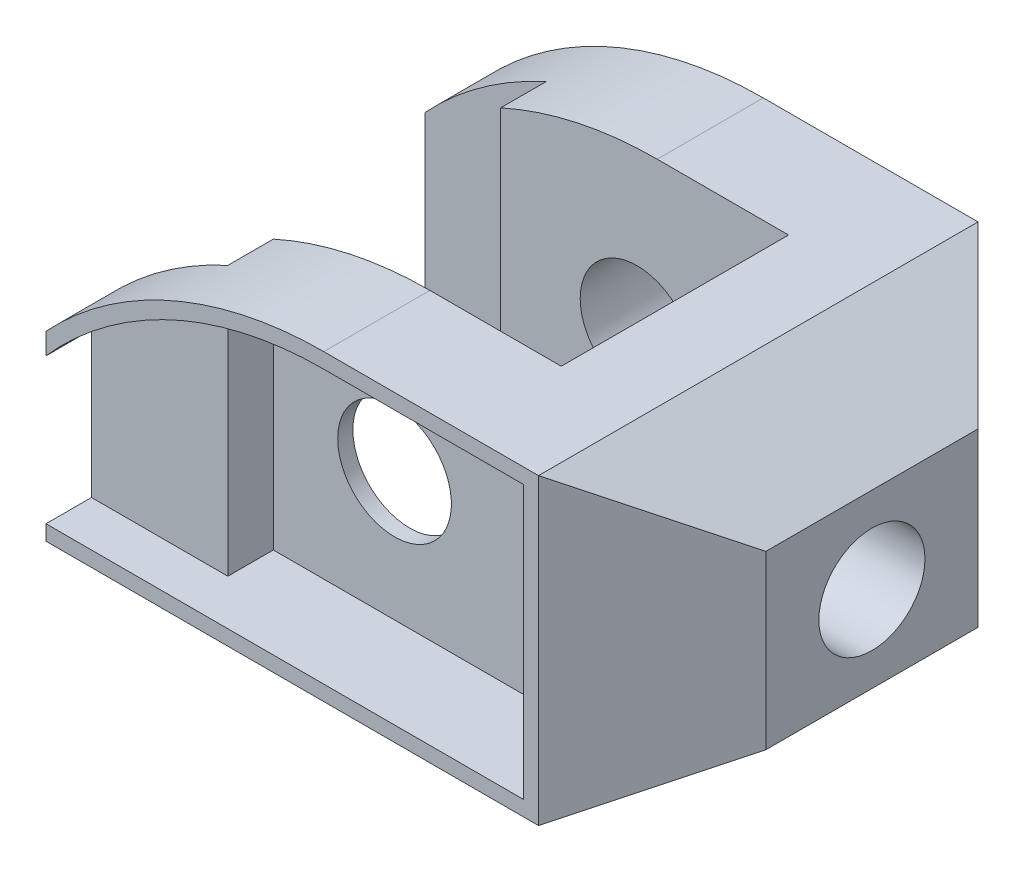
ISO-10303-21;
HEADER;
FILE_DESCRIPTION(('STEP AP214'),'2;1');
FILE_NAME('part.step','',(''),(''),'','','');
FILE_SCHEMA(('AUTOMOTIVE_DESIGN { 1 0 10303 214 1 1 1 1 }'));
ENDSEC;
DATA;
#1=APPLICATION_CONTEXT('core data for automotive mechanical design processes');
#2=APPLICATION_PROTOCOL_DEFINITION('international standard','automotive_design',2000,#1);
#3=PRODUCT_CONTEXT('',#1,'mechanical');
#4=PRODUCT('Part','Part','',(#3));
#5=PRODUCT_RELATED_PRODUCT_CATEGORY('part','',(#4));
#6=PRODUCT_DEFINITION_FORMATION('','',#4);
#7=PRODUCT_DEFINITION_CONTEXT('part definition',#1,'design');
#8=PRODUCT_DEFINITION('design','',#6,#7);
#9=PRODUCT_DEFINITION_SHAPE('','',#8);
#10=(LENGTH_UNIT() NAMED_UNIT(*) SI_UNIT(.MILLI.,.METRE.));
#11=(NAMED_UNIT(*) PLANE_ANGLE_UNIT() SI_UNIT($,.RADIAN.));
#12=(NAMED_UNIT(*) SI_UNIT($,.STERADIAN.) SOLID_ANGLE_UNIT());
#13=UNCERTAINTY_MEASURE_WITH_UNIT(LENGTH_MEASURE(1.E-05),#10,'distance_accuracy_value','');
#14=(GEOMETRIC_REPRESENTATION_CONTEXT(3) GLOBAL_UNCERTAINTY_ASSIGNED_CONTEXT((#13)) GLOBAL_UNIT_ASSIGNED_CONTEXT((#10,
#11,#12)) REPRESENTATION_CONTEXT('',''));
#15=CARTESIAN_POINT('',(0.,0.,0.));
#16=DIRECTION('',(0.,0.,1.));
#17=DIRECTION('',(1.,0.,0.));
#18=AXIS2_PLACEMENT_3D('',#15,#16,#17);
#19=CARTESIAN_POINT('',(-47.,34.2242218715862,46.));
#20=DIRECTION('',(-1.,0.,0.));
#21=DIRECTION('',(0.,-1.,0.));
#22=AXIS2_PLACEMENT_3D('',#19,#20,#21);
#23=PLANE('',#22);
#24=DIRECTION('',(0.,1.,0.));
#25=VECTOR('',#24,1.);
#26=CARTESIAN_POINT('',(-47.,2.,52.));
#27=LINE('',#26,#25);
#28=CARTESIAN_POINT('',(-47.,2.,52.));
#29=VERTEX_POINT('',#28);
#30=CARTESIAN_POINT('',(-47.,34.2242218715862,52.));
#31=VERTEX_POINT('',#30);
#32=EDGE_CURVE('E211',#29,#31,#27,.T.);
#33=ORIENTED_EDGE('',*,*,#32,.F.);
#34=DIRECTION('',(0.,0.,1.));
#35=VECTOR('',#34,1.);
#36=CARTESIAN_POINT('',(-47.,2.,46.));
#37=LINE('',#36,#35);
#38=CARTESIAN_POINT('',(-47.,2.,46.));
#39=VERTEX_POINT('',#38);
#40=EDGE_CURVE('E263',#39,#29,#37,.T.);
#41=ORIENTED_EDGE('',*,*,#40,.F.);
#42=DIRECTION('',(0.,-1.,0.));
#43=VECTOR('',#42,1.);
#44=CARTESIAN_POINT('',(-47.,34.2242218715862,46.));
#45=LINE('',#44,#43);
#46=CARTESIAN_POINT('',(-47.,34.2242218715862,46.));
#47=VERTEX_POINT('',#46);
#48=EDGE_CURVE('E233',#47,#39,#45,.T.);
#49=ORIENTED_EDGE('',*,*,#48,.F.);
#50=DIRECTION('',(0.,0.,1.));
#51=VECTOR('',#50,1.);
#52=CARTESIAN_POINT('',(-47.,34.2242218715862,46.));
#53=LINE('',#52,#51);
#54=EDGE_CURVE('E246',#47,#31,#53,.T.);
#55=ORIENTED_EDGE('',*,*,#54,.T.);
#56=EDGE_LOOP('',(#33,#41,#49,#55));
#57=FACE_BOUND('',#56,.T.);
#58=ADVANCED_FACE('F41',(#57),#23,.F.);
#59=CARTESIAN_POINT('',(-31.,19.,58.));
#60=DIRECTION('',(0.,0.,-1.));
#61=DIRECTION('',(-1.,0.,0.));
#62=AXIS2_PLACEMENT_3D('',#59,#60,#61);
#63=CYLINDRICAL_SURFACE('',#62,7.5);
#64=CARTESIAN_POINT('',(-31.,19.,44.));
#65=DIRECTION('',(0.,0.,1.));
#66=DIRECTION('',(1.,0.,0.));
#67=AXIS2_PLACEMENT_3D('',#64,#65,#66);
#68=CIRCLE('',#67,7.5);
#69=CARTESIAN_POINT('',(-38.5,19.,44.));
#70=VERTEX_POINT('',#69);
#71=EDGE_CURVE('E315',#70,#70,#68,.T.);
#72=CARTESIAN_POINT('',(-31.,19.,46.));
#73=DIRECTION('',(0.,0.,1.));
#74=DIRECTION('',(1.,0.,0.));
#75=AXIS2_PLACEMENT_3D('',#72,#73,#74);
#76=CIRCLE('',#75,7.5);
#77=CARTESIAN_POINT('',(-38.5,19.,46.));
#78=VERTEX_POINT('',#77);
#79=EDGE_CURVE('E45',#78,#78,#76,.T.);
#80=CARTESIAN_POINT('',(-38.5,19.,44.));
#81=CARTESIAN_POINT('',(-38.5,19.,44.0208333333333));
#82=CARTESIAN_POINT('',(-38.5,19.,44.0416666666667));
#83=CARTESIAN_POINT('',(-38.5,19.,44.0833333333333));
#84=CARTESIAN_POINT('',(-38.5,19.,44.1041666666667));
#85=CARTESIAN_POINT('',(-38.5,19.,44.1458333333333));
#86=CARTESIAN_POINT('',(-38.5,19.,44.1666666666667));
#87=CARTESIAN_POINT('',(-38.5,19.,44.2083333333333));
#88=CARTESIAN_POINT('',(-38.5,19.,44.2291666666667));
#89=CARTESIAN_POINT('',(-38.5,19.,44.2708333333333));
#90=CARTESIAN_POINT('',(-38.5,19.,44.2916666666667));
#91=CARTESIAN_POINT('',(-38.5,19.,44.3333333333333));
#92=CARTESIAN_POINT('',(-38.5,19.,44.3541666666667));
#93=CARTESIAN_POINT('',(-38.5,19.,44.3958333333333));
#94=CARTESIAN_POINT('',(-38.5,19.,44.4166666666667));
#95=CARTESIAN_POINT('',(-38.5,19.,44.4583333333333));
#96=CARTESIAN_POINT('',(-38.5,19.,44.4791666666667));
#97=CARTESIAN_POINT('',(-38.5,19.,44.5208333333333));
#98=CARTESIAN_POINT('',(-38.5,19.,44.5416666666667));
#99=CARTESIAN_POINT('',(-38.5,19.,44.5833333333333));
#100=CARTESIAN_POINT('',(-38.5,19.,44.6041666666667));
#101=CARTESIAN_POINT('',(-38.5,19.,44.6458333333333));
#102=CARTESIAN_POINT('',(-38.5,19.,44.6666666666667));
#103=CARTESIAN_POINT('',(-38.5,19.,44.7083333333333));
#104=CARTESIAN_POINT('',(-38.5,19.,44.7291666666667));
#105=CARTESIAN_POINT('',(-38.5,19.,44.7708333333333));
#106=CARTESIAN_POINT('',(-38.5,19.,44.7916666666667));
#107=CARTESIAN_POINT('',(-38.5,19.,44.8333333333333));
#108=CARTESIAN_POINT('',(-38.5,19.,44.8541666666667));
#109=CARTESIAN_POINT('',(-38.5,19.,44.8958333333333));
#110=CARTESIAN_POINT('',(-38.5,19.,44.9166666666667));
#111=CARTESIAN_POINT('',(-38.5,19.,44.9583333333333));
#112=CARTESIAN_POINT('',(-38.5,19.,44.9791666666667));
#113=CARTESIAN_POINT('',(-38.5,19.,45.0208333333333));
#114=CARTESIAN_POINT('',(-38.5,19.,45.0416666666667));
#115=CARTESIAN_POINT('',(-38.5,19.,45.0833333333333));
#116=CARTESIAN_POINT('',(-38.5,19.,45.1041666666667));
#117=CARTESIAN_POINT('',(-38.5,19.,45.1458333333333));
#118=CARTESIAN_POINT('',(-38.5,19.,45.1666666666667));
#119=CARTESIAN_POINT('',(-38.5,19.,45.2083333333333));
#120=CARTESIAN_POINT('',(-38.5,19.,45.2291666666667));
#121=CARTESIAN_POINT('',(-38.5,19.,45.2708333333333));
#122=CARTESIAN_POINT('',(-38.5,19.,45.2916666666667));
#123=CARTESIAN_POINT('',(-38.5,19.,45.3333333333333));
#124=CARTESIAN_POINT('',(-38.5,19.,45.3541666666667));
#125=CARTESIAN_POINT('',(-38.5,19.,45.3958333333333));
#126=CARTESIAN_POINT('',(-38.5,19.,45.4166666666667));
#127=CARTESIAN_POINT('',(-38.5,19.,45.4583333333333));
#128=CARTESIAN_POINT('',(-38.5,19.,45.4791666666667));
#129=CARTESIAN_POINT('',(-38.5,19.,45.5208333333333));
#130=CARTESIAN_POINT('',(-38.5,19.,45.5416666666667));
#131=CARTESIAN_POINT('',(-38.5,19.,45.5833333333333));
#132=CARTESIAN_POINT('',(-38.5,19.,45.6041666666667));
#133=CARTESIAN_POINT('',(-38.5,19.,45.6458333333333));
#134=CARTESIAN_POINT('',(-38.5,19.,45.6666666666667));
#135=CARTESIAN_POINT('',(-38.5,19.,45.7083333333333));
#136=CARTESIAN_POINT('',(-38.5,19.,45.7291666666667));
#137=CARTESIAN_POINT('',(-38.5,19.,45.7708333333333));
#138=CARTESIAN_POINT('',(-38.5,19.,45.7916666666667));
#139=CARTESIAN_POINT('',(-38.5,19.,45.8333333333333));
#140=CARTESIAN_POINT('',(-38.5,19.,45.8541666666667));
#141=CARTESIAN_POINT('',(-38.5,19.,45.8958333333333));
#142=CARTESIAN_POINT('',(-38.5,19.,45.9166666666667));
#143=CARTESIAN_POINT('',(-38.5,19.,45.9583333333333));
#144=CARTESIAN_POINT('',(-38.5,19.,45.9791666666667));
#145=CARTESIAN_POINT('',(-38.5,19.,46.));
#146=B_SPLINE_CURVE_WITH_KNOTS('',3,(#80,#81,#82,#83,#84,#85,#86,#87,#88,#89,#90,#91,#92,#93,
#94,#95,#96,#97,#98,#99,#100,#101,#102,#103,#104,#105,#106,#107,#108,#109,#110,#111,#112,#113,
#114,#115,#116,#117,#118,#119,#120,#121,#122,#123,#124,#125,#126,#127,#128,#129,#130,#131,#132,
#133,#134,#135,#136,#137,#138,#139,#140,#141,#142,#143,#144,#145),.UNSPECIFIED.,.F.,.F.,(4,2,2,
2,2,2,2,2,2,2,2,2,2,2,2,2,2,2,2,2,2,2,2,2,2,2,2,2,2,2,2,2,4),(0.,0.0625000000000001,0.125,
0.1875,0.25,0.3125,0.374999999999993,0.437499999999993,0.499999999999994,0.562499999999994,
0.624999999999994,0.687499999999994,0.749999999999994,0.812499999999994,0.874999999999994,
0.937499999999987,0.999999999999987,1.06249999999999,1.12499999999999,1.18749999999999,
1.24999999999999,1.31249999999999,1.37499999999998,1.43749999999998,1.49999999999998,
1.56249999999998,1.62499999999998,1.68749999999998,1.74999999999998,1.81249999999998,
1.87499999999998,1.93749999999997,1.99999999999997),.UNSPECIFIED.);
#147=EDGE_CURVE('BSEAM413',#70,#78,#146,.T.);
#148=ORIENTED_EDGE('',*,*,#71,.F.);
#149=ORIENTED_EDGE('',*,*,#79,.T.);
#150=ORIENTED_EDGE('',*,*,#147,.T.);
#151=ORIENTED_EDGE('',*,*,#147,.F.);
#152=EDGE_LOOP('',(#148,#150,#149,#151));
#153=FACE_BOUND('',#152,.T.);
#154=ADVANCED_FACE('F413',(#153),#63,.F.);
#155=CARTESIAN_POINT('',(-28.3393944403533,-10.,58.));
#156=DIRECTION('',(0.,0.,-1.));
#157=DIRECTION('',(-1.,0.,0.));
#158=AXIS2_PLACEMENT_3D('',#155,#156,#157);
#159=PLANE('',#158);
#160=DIRECTION('',(0.,-1.,0.));
#161=VECTOR('',#160,1.);
#162=CARTESIAN_POINT('',(-65.,0.,58.));
#163=LINE('',#162,#161);
#164=CARTESIAN_POINT('',(-65.,24.,58.));
#165=VERTEX_POINT('',#164);
#166=CARTESIAN_POINT('',(-65.,21.1865019003667,58.));
#167=VERTEX_POINT('',#166);
#168=EDGE_CURVE('E364',#165,#167,#163,.T.);
#169=ORIENTED_EDGE('',*,*,#168,.T.);
#170=CARTESIAN_POINT('',(-27.4075472422431,-11.7696499087035,58.));
#171=DIRECTION('',(0.,0.,1.));
#172=DIRECTION('',(1.,0.,0.));
#173=AXIS2_PLACEMENT_3D('',#170,#171,#172);
#174=CIRCLE('',#173,49.9930039746229);
#175=CARTESIAN_POINT('',(-47.,34.2242218715862,58.));
#176=VERTEX_POINT('',#175);
#177=EDGE_CURVE('E205',#176,#167,#174,.T.);
#178=ORIENTED_EDGE('',*,*,#177,.F.);
#179=CARTESIAN_POINT('',(-28.3393944403533,-10.,58.));
#180=DIRECTION('',(0.,0.,1.));
#181=DIRECTION('',(1.,0.,0.));
#182=AXIS2_PLACEMENT_3D('',#179,#180,#181);
#183=CIRCLE('',#182,48.);
#184=CARTESIAN_POINT('',(-28.3393944403533,38.,58.));
#185=VERTEX_POINT('',#184);
#186=EDGE_CURVE('E228',#185,#176,#183,.T.);
#187=ORIENTED_EDGE('',*,*,#186,.F.);
#188=DIRECTION('',(-1.,0.,0.));
#189=VECTOR('',#188,1.);
#190=CARTESIAN_POINT('',(-2.,38.,58.));
#191=LINE('',#190,#189);
#192=CARTESIAN_POINT('',(-2.,38.,58.));
#193=VERTEX_POINT('',#192);
#194=EDGE_CURVE('E234',#193,#185,#191,.T.);
#195=ORIENTED_EDGE('',*,*,#194,.F.);
#196=DIRECTION('',(0.,1.,0.));
#197=VECTOR('',#196,1.);
#198=CARTESIAN_POINT('',(-2.,2.,58.));
#199=LINE('',#198,#197);
#200=CARTESIAN_POINT('',(-2.,2.,58.));
#201=VERTEX_POINT('',#200);
#202=EDGE_CURVE('E252',#201,#193,#199,.T.);
#203=ORIENTED_EDGE('',*,*,#202,.F.);
#204=DIRECTION('',(1.,0.,0.));
#205=VECTOR('',#204,1.);
#206=CARTESIAN_POINT('',(-47.,2.,58.));
#207=LINE('',#206,#205);
#208=CARTESIAN_POINT('',(-65.,1.99999999999999,58.));
#209=VERTEX_POINT('',#208);
#210=EDGE_CURVE('E249',#209,#201,#207,.T.);
#211=ORIENTED_EDGE('',*,*,#210,.F.);
#212=CARTESIAN_POINT('',(-65.,0.,58.));
#213=VERTEX_POINT('',#212);
#214=EDGE_CURVE('E363',#209,#213,#163,.T.);
#215=ORIENTED_EDGE('',*,*,#214,.T.);
#216=DIRECTION('',(1.,0.,0.));
#217=VECTOR('',#216,1.);
#218=CARTESIAN_POINT('',(0.,0.,58.));
#219=LINE('',#218,#217);
#220=CARTESIAN_POINT('',(0.,0.,58.));
#221=VERTEX_POINT('',#220);
#222=EDGE_CURVE('E366',#213,#221,#219,.T.);
#223=ORIENTED_EDGE('',*,*,#222,.T.);
#224=DIRECTION('',(0.,-1.,0.));
#225=VECTOR('',#224,1.);
#226=CARTESIAN_POINT('',(0.,40.,58.));
#227=LINE('',#226,#225);
#228=CARTESIAN_POINT('',(0.,40.,58.));
#229=VERTEX_POINT('',#228);
#230=EDGE_CURVE('E275',#229,#221,#227,.T.);
#231=ORIENTED_EDGE('',*,*,#230,.F.);
#232=DIRECTION('',(-1.,0.,0.));
#233=VECTOR('',#232,1.);
#234=CARTESIAN_POINT('',(0.,40.,58.));
#235=LINE('',#234,#233);
#236=CARTESIAN_POINT('',(-28.3393944403533,40.,58.));
#237=VERTEX_POINT('',#236);
#238=EDGE_CURVE('E358',#229,#237,#235,.T.);
#239=ORIENTED_EDGE('',*,*,#238,.T.);
#240=CARTESIAN_POINT('',(-28.3393944403533,-10.,58.));
#241=DIRECTION('',(0.,0.,1.));
#242=DIRECTION('',(-1.,0.,0.));
#243=AXIS2_PLACEMENT_3D('',#240,#241,#242);
#244=CIRCLE('',#243,50.);
#245=EDGE_CURVE('E360',#237,#165,#244,.T.);
#246=ORIENTED_EDGE('',*,*,#245,.T.);
#247=EDGE_LOOP('',(#169,#178,#187,#195,#203,#211,#215,#223,#231,#239,#246));
#248=FACE_BOUND('',#247,.T.);
#249=ADVANCED_FACE('F436',(#248),#159,.F.);
#250=CARTESIAN_POINT('',(-28.3393944403533,-10.,0.));
#251=DIRECTION('',(0.,0.,-1.));
#252=DIRECTION('',(-1.,0.,0.));
#253=AXIS2_PLACEMENT_3D('',#250,#251,#252);
#254=PLANE('',#253);
#255=CARTESIAN_POINT('',(-31.,19.,0.));
#256=DIRECTION('',(0.,0.,1.));
#257=DIRECTION('',(1.,0.,0.));
#258=AXIS2_PLACEMENT_3D('',#255,#256,#257);
#259=CIRCLE('',#258,7.5);
#260=CARTESIAN_POINT('',(-38.5,19.,0.));
#261=VERTEX_POINT('',#260);
#262=EDGE_CURVE('E354',#261,#261,#259,.T.);
#263=ORIENTED_EDGE('',*,*,#262,.T.);
#264=EDGE_LOOP('',(#263));
#265=FACE_BOUND('',#264,.T.);
#266=DIRECTION('',(-1.,0.,0.));
#267=VECTOR('',#266,1.);
#268=CARTESIAN_POINT('',(0.,40.,0.));
#269=LINE('',#268,#267);
#270=CARTESIAN_POINT('',(0.,40.,0.));
#271=VERTEX_POINT('',#270);
#272=CARTESIAN_POINT('',(-28.3393944403533,40.,0.));
#273=VERTEX_POINT('',#272);
#274=EDGE_CURVE('E357',#271,#273,#269,.T.);
#275=ORIENTED_EDGE('',*,*,#274,.F.);
#276=DIRECTION('',(0.,-1.,0.));
#277=VECTOR('',#276,1.);
#278=CARTESIAN_POINT('',(0.,40.,0.));
#279=LINE('',#278,#277);
#280=CARTESIAN_POINT('',(0.,0.,0.));
#281=VERTEX_POINT('',#280);
#282=EDGE_CURVE('E274',#271,#281,#279,.T.);
#283=ORIENTED_EDGE('',*,*,#282,.T.);
#284=DIRECTION('',(1.,0.,0.));
#285=VECTOR('',#284,1.);
#286=CARTESIAN_POINT('',(0.,0.,0.));
#287=LINE('',#286,#285);
#288=CARTESIAN_POINT('',(-65.,0.,0.));
#289=VERTEX_POINT('',#288);
#290=EDGE_CURVE('E361',#289,#281,#287,.T.);
#291=ORIENTED_EDGE('',*,*,#290,.F.);
#292=DIRECTION('',(0.,-1.,0.));
#293=VECTOR('',#292,1.);
#294=CARTESIAN_POINT('',(-65.,0.,0.));
#295=LINE('',#294,#293);
#296=CARTESIAN_POINT('',(-65.,24.,0.));
#297=VERTEX_POINT('',#296);
#298=EDGE_CURVE('E375',#297,#289,#295,.T.);
#299=ORIENTED_EDGE('',*,*,#298,.F.);
#300=CARTESIAN_POINT('',(-28.3393944403533,-10.,0.));
#301=DIRECTION('',(0.,0.,1.));
#302=DIRECTION('',(-1.,0.,0.));
#303=AXIS2_PLACEMENT_3D('',#300,#301,#302);
#304=CIRCLE('',#303,50.);
#305=EDGE_CURVE('E372',#273,#297,#304,.T.);
#306=ORIENTED_EDGE('',*,*,#305,.F.);
#307=EDGE_LOOP('',(#275,#283,#291,#299,#306));
#308=FACE_BOUND('',#307,.T.);
#309=ADVANCED_FACE('F510',(#265,#308),#254,.T.);
#310=CARTESIAN_POINT('',(0.,0.,58.));
#311=DIRECTION('',(-0.499999999999995,0.866025403784441,0.));
#312=DIRECTION('',(-0.866025403784442,-0.499999999999995,0.));
#313=AXIS2_PLACEMENT_3D('',#310,#311,#312);
#314=PLANE('',#313);
#315=DIRECTION('',(-0.654653670707977,-0.377964473009222,-0.65465367070798));
#316=VECTOR('',#315,1.);
#317=CARTESIAN_POINT('',(24.857142857143,14.3512781198563,24.857142857143));
#318=LINE('',#317,#316);
#319=CARTESIAN_POINT('',(15.,8.66025403784428,15.));
#320=VERTEX_POINT('',#319);
#321=EDGE_CURVE('E282',#320,#281,#318,.T.);
#322=ORIENTED_EDGE('',*,*,#321,.F.);
#323=DIRECTION('',(0.,0.,-1.));
#324=VECTOR('',#323,1.);
#325=CARTESIAN_POINT('',(15.,8.66025403784427,58.));
#326=LINE('',#325,#324);
#327=CARTESIAN_POINT('',(15.,8.66025403784428,43.));
#328=VERTEX_POINT('',#327);
#329=EDGE_CURVE('E400',#328,#320,#326,.T.);
#330=ORIENTED_EDGE('',*,*,#329,.F.);
#331=DIRECTION('',(0.654653670707977,0.377964473009222,-0.65465367070798));
#332=VECTOR('',#331,1.);
#333=CARTESIAN_POINT('',(0.,0.,58.));
#334=LINE('',#333,#332);
#335=EDGE_CURVE('E278',#221,#328,#334,.T.);
#336=ORIENTED_EDGE('',*,*,#335,.F.);
#337=DIRECTION('',(0.,0.,-1.));
#338=VECTOR('',#337,1.);
#339=CARTESIAN_POINT('',(0.,0.,58.));
#340=LINE('',#339,#338);
#341=EDGE_CURVE('E369',#221,#281,#340,.T.);
#342=ORIENTED_EDGE('',*,*,#341,.T.);
#343=EDGE_LOOP('',(#322,#330,#336,#342));
#344=FACE_BOUND('',#343,.T.);
#345=ADVANCED_FACE('F43',(#344),#314,.F.);
#346=CARTESIAN_POINT('',(15.,8.66025403784427,58.));
#347=DIRECTION('',(-1.,0.,0.));
#348=DIRECTION('',(0.,-1.,0.));
#349=AXIS2_PLACEMENT_3D('',#346,#347,#348);
#350=PLANE('',#349);
#351=CARTESIAN_POINT('',(15.,20.,29.));
#352=DIRECTION('',(-1.,0.,0.));
#353=DIRECTION('',(0.,-1.,0.));
#354=AXIS2_PLACEMENT_3D('',#351,#352,#353);
#355=CIRCLE('',#354,7.);
#356=CARTESIAN_POINT('',(15.,13.,29.));
#357=VERTEX_POINT('',#356);
#358=EDGE_CURVE('E268',#357,#357,#355,.T.);
#359=ORIENTED_EDGE('',*,*,#358,.T.);
#360=EDGE_LOOP('',(#359));
#361=FACE_BOUND('',#360,.T.);
#362=DIRECTION('',(0.,-1.,0.));
#363=VECTOR('',#362,1.);
#364=CARTESIAN_POINT('',(15.,40.,15.));
#365=LINE('',#364,#363);
#366=CARTESIAN_POINT('',(15.,31.3397459621556,15.));
#367=VERTEX_POINT('',#366);
#368=EDGE_CURVE('E272',#367,#320,#365,.T.);
#369=ORIENTED_EDGE('',*,*,#368,.F.);
#370=DIRECTION('',(0.,0.,-1.));
#371=VECTOR('',#370,1.);
#372=CARTESIAN_POINT('',(15.,31.3397459621556,58.));
#373=LINE('',#372,#371);
#374=CARTESIAN_POINT('',(15.,31.3397459621556,43.));
#375=VERTEX_POINT('',#374);
#376=EDGE_CURVE('E397',#375,#367,#373,.T.);
#377=ORIENTED_EDGE('',*,*,#376,.F.);
#378=DIRECTION('',(0.,-1.,0.));
#379=VECTOR('',#378,1.);
#380=CARTESIAN_POINT('',(15.,40.,43.));
#381=LINE('',#380,#379);
#382=EDGE_CURVE('E66',#375,#328,#381,.T.);
#383=ORIENTED_EDGE('',*,*,#382,.T.);
#384=ORIENTED_EDGE('',*,*,#329,.T.);
#385=EDGE_LOOP('',(#369,#377,#383,#384));
#386=FACE_BOUND('',#385,.T.);
#387=ADVANCED_FACE('F530',(#361,#386),#350,.F.);
#388=CARTESIAN_POINT('',(15.,31.3397459621556,58.));
#389=DIRECTION('',(-0.500000000000001,-0.866025403784438,0.));
#390=DIRECTION('',(0.866025403784438,-0.500000000000001,0.));
#391=AXIS2_PLACEMENT_3D('',#388,#389,#390);
#392=PLANE('',#391);
#393=DIRECTION('',(0.654653670707976,-0.377964473009227,0.654653670707978));
#394=VECTOR('',#393,1.);
#395=CARTESIAN_POINT('',(33.4285714285714,20.7000052870896,33.4285714285715));
#396=LINE('',#395,#394);
#397=EDGE_CURVE('E11',#271,#367,#396,.T.);
#398=ORIENTED_EDGE('',*,*,#397,.F.);
#399=DIRECTION('',(0.,0.,-1.));
#400=VECTOR('',#399,1.);
#401=CARTESIAN_POINT('',(0.,40.,58.));
#402=LINE('',#401,#400);
#403=EDGE_CURVE('E394',#229,#271,#402,.T.);
#404=ORIENTED_EDGE('',*,*,#403,.F.);
#405=DIRECTION('',(-0.654653670707976,0.377964473009227,0.654653670707978));
#406=VECTOR('',#405,1.);
#407=CARTESIAN_POINT('',(8.57142857142856,35.0512834069461,49.4285714285714));
#408=LINE('',#407,#406);
#409=EDGE_CURVE('E50',#375,#229,#408,.T.);
#410=ORIENTED_EDGE('',*,*,#409,.F.);
#411=ORIENTED_EDGE('',*,*,#376,.T.);
#412=EDGE_LOOP('',(#398,#404,#410,#411));
#413=FACE_BOUND('',#412,.T.);
#414=ADVANCED_FACE('F528',(#413),#392,.F.);
#415=CARTESIAN_POINT('',(-28.3393944403533,-10.,58.));
#416=DIRECTION('',(0.,0.,-1.));
#417=DIRECTION('',(-1.,0.,0.));
#418=AXIS2_PLACEMENT_3D('',#415,#416,#417);
#419=CYLINDRICAL_SURFACE('',#418,50.);
#420=DIRECTION('',(0.,0.,-1.));
#421=VECTOR('',#420,1.);
#422=CARTESIAN_POINT('',(-28.3393944403533,40.,58.));
#423=LINE('',#422,#421);
#424=CARTESIAN_POINT('',(-28.3393944403533,40.,44.));
#425=VERTEX_POINT('',#424);
#426=EDGE_CURVE('E391',#237,#425,#423,.T.);
#427=ORIENTED_EDGE('',*,*,#426,.T.);
#428=CARTESIAN_POINT('',(-28.3393944403533,-10.,44.));
#429=DIRECTION('',(0.,0.,1.));
#430=DIRECTION('',(1.,0.,0.));
#431=AXIS2_PLACEMENT_3D('',#428,#429,#430);
#432=CIRCLE('',#431,50.);
#433=CARTESIAN_POINT('',(-49.,35.5317403347236,44.));
#434=VERTEX_POINT('',#433);
#435=EDGE_CURVE('E335',#425,#434,#432,.T.);
#436=ORIENTED_EDGE('',*,*,#435,.T.);
#437=DIRECTION('',(0.,0.,-1.));
#438=VECTOR('',#437,1.);
#439=CARTESIAN_POINT('',(-49.,35.5317403347236,58.));
#440=LINE('',#439,#438);
#441=CARTESIAN_POINT('',(-49.,35.5317403347236,50.));
#442=VERTEX_POINT('',#441);
#443=EDGE_CURVE('E351',#434,#442,#440,.F.);
#444=ORIENTED_EDGE('',*,*,#443,.T.);
#445=CARTESIAN_POINT('',(-28.3393944403533,-10.,50.));
#446=DIRECTION('',(0.,0.,1.));
#447=DIRECTION('',(1.,0.,0.));
#448=AXIS2_PLACEMENT_3D('',#445,#446,#447);
#449=CIRCLE('',#448,50.);
#450=CARTESIAN_POINT('',(-65.,24.,50.));
#451=VERTEX_POINT('',#450);
#452=EDGE_CURVE('E348',#442,#451,#449,.T.);
#453=ORIENTED_EDGE('',*,*,#452,.T.);
#454=DIRECTION('',(0.,0.,-1.));
#455=VECTOR('',#454,1.);
#456=CARTESIAN_POINT('',(-65.,24.,58.));
#457=LINE('',#456,#455);
#458=EDGE_CURVE('E387',#165,#451,#457,.T.);
#459=ORIENTED_EDGE('',*,*,#458,.F.);
#460=ORIENTED_EDGE('',*,*,#245,.F.);
#461=EDGE_LOOP('',(#427,#436,#444,#453,#459,#460));
#462=FACE_BOUND('',#461,.T.);
#463=ADVANCED_FACE('F442',(#462),#419,.T.);
#464=CARTESIAN_POINT('',(-65.,0.,58.));
#465=DIRECTION('',(1.,0.,0.));
#466=DIRECTION('',(0.,0.,-1.));
#467=AXIS2_PLACEMENT_3D('',#464,#465,#466);
#468=PLANE('',#467);
#469=DIRECTION('',(0.,-1.,0.));
#470=VECTOR('',#469,1.);
#471=CARTESIAN_POINT('',(-65.,21.1865019003667,52.));
#472=LINE('',#471,#470);
#473=CARTESIAN_POINT('',(-65.,21.1865019003667,52.));
#474=VERTEX_POINT('',#473);
#475=CARTESIAN_POINT('',(-65.,1.99999999999999,52.));
#476=VERTEX_POINT('',#475);
#477=EDGE_CURVE('E214',#474,#476,#472,.T.);
#478=ORIENTED_EDGE('',*,*,#477,.F.);
#479=DIRECTION('',(0.,0.,1.));
#480=VECTOR('',#479,1.);
#481=CARTESIAN_POINT('',(-65.,21.1865019003667,52.));
#482=LINE('',#481,#480);
#483=EDGE_CURVE('E200',#474,#167,#482,.T.);
#484=ORIENTED_EDGE('',*,*,#483,.T.);
#485=ORIENTED_EDGE('',*,*,#168,.F.);
#486=ORIENTED_EDGE('',*,*,#458,.T.);
#487=DIRECTION('',(0.,1.,0.));
#488=VECTOR('',#487,1.);
#489=CARTESIAN_POINT('',(-65.,0.,50.));
#490=LINE('',#489,#488);
#491=CARTESIAN_POINT('',(-65.,0.,50.));
#492=VERTEX_POINT('',#491);
#493=EDGE_CURVE('E325',#492,#451,#490,.T.);
#494=ORIENTED_EDGE('',*,*,#493,.F.);
#495=DIRECTION('',(0.,0.,-1.));
#496=VECTOR('',#495,1.);
#497=CARTESIAN_POINT('',(-65.,0.,58.));
#498=LINE('',#497,#496);
#499=EDGE_CURVE('E383',#213,#492,#498,.T.);
#500=ORIENTED_EDGE('',*,*,#499,.F.);
#501=ORIENTED_EDGE('',*,*,#214,.F.);
#502=DIRECTION('',(0.,0.,1.));
#503=VECTOR('',#502,1.);
#504=CARTESIAN_POINT('',(-65.,1.99999999999999,52.));
#505=LINE('',#504,#503);
#506=EDGE_CURVE('E210',#476,#209,#505,.T.);
#507=ORIENTED_EDGE('',*,*,#506,.F.);
#508=EDGE_LOOP('',(#478,#484,#485,#486,#494,#500,#501,#507));
#509=FACE_BOUND('',#508,.T.);
#510=ADVANCED_FACE('F218',(#509),#468,.F.);
#511=CARTESIAN_POINT('',(-31.,19.,14.));
#512=DIRECTION('',(0.,0.,-1.));
#513=DIRECTION('',(-1.,0.,0.));
#514=AXIS2_PLACEMENT_3D('',#511,#512,#513);
#515=CIRCLE('',#514,7.5);
#516=CARTESIAN_POINT('',(-38.5,19.,14.));
#517=VERTEX_POINT('',#516);
#518=EDGE_CURVE('E338',#517,#517,#515,.T.);
#519=CARTESIAN_POINT('',(-38.5,19.,14.));
#520=CARTESIAN_POINT('',(-38.5,19.,13.8541666666667));
#521=CARTESIAN_POINT('',(-38.5,19.,13.7083333333333));
#522=CARTESIAN_POINT('',(-38.5,19.,13.4166666666667));
#523=CARTESIAN_POINT('',(-38.5,19.,13.2708333333333));
#524=CARTESIAN_POINT('',(-38.5,19.,12.9791666666667));
#525=CARTESIAN_POINT('',(-38.5,19.,12.8333333333333));
#526=CARTESIAN_POINT('',(-38.5,19.,12.5416666666667));
#527=CARTESIAN_POINT('',(-38.5,19.,12.3958333333333));
#528=CARTESIAN_POINT('',(-38.5,19.,12.1041666666667));
#529=CARTESIAN_POINT('',(-38.5,19.,11.9583333333333));
#530=CARTESIAN_POINT('',(-38.5,19.,11.6666666666667));
#531=CARTESIAN_POINT('',(-38.5,19.,11.5208333333333));
#532=CARTESIAN_POINT('',(-38.5,19.,11.2291666666667));
#533=CARTESIAN_POINT('',(-38.5,19.,11.0833333333333));
#534=CARTESIAN_POINT('',(-38.5,19.,10.7916666666667));
#535=CARTESIAN_POINT('',(-38.5,19.,10.6458333333333));
#536=CARTESIAN_POINT('',(-38.5,19.,10.3541666666667));
#537=CARTESIAN_POINT('',(-38.5,19.,10.2083333333333));
#538=CARTESIAN_POINT('',(-38.5,19.,9.91666666666667));
#539=CARTESIAN_POINT('',(-38.5,19.,9.77083333333333));
#540=CARTESIAN_POINT('',(-38.5,19.,9.47916666666667));
#541=CARTESIAN_POINT('',(-38.5,19.,9.33333333333333));
#542=CARTESIAN_POINT('',(-38.5,19.,9.04166666666667));
#543=CARTESIAN_POINT('',(-38.5,19.,8.89583333333333));
#544=CARTESIAN_POINT('',(-38.5,19.,8.60416666666667));
#545=CARTESIAN_POINT('',(-38.5,19.,8.45833333333333));
#546=CARTESIAN_POINT('',(-38.5,19.,8.16666666666667));
#547=CARTESIAN_POINT('',(-38.5,19.,8.02083333333333));
#548=CARTESIAN_POINT('',(-38.5,19.,7.72916666666667));
#549=CARTESIAN_POINT('',(-38.5,19.,7.58333333333333));
#550=CARTESIAN_POINT('',(-38.5,19.,7.29166666666667));
#551=CARTESIAN_POINT('',(-38.5,19.,7.14583333333333));
#552=CARTESIAN_POINT('',(-38.5,19.,6.85416666666667));
#553=CARTESIAN_POINT('',(-38.5,19.,6.70833333333333));
#554=CARTESIAN_POINT('',(-38.5,19.,6.41666666666667));
#555=CARTESIAN_POINT('',(-38.5,19.,6.27083333333333));
#556=CARTESIAN_POINT('',(-38.5,19.,5.97916666666667));
#557=CARTESIAN_POINT('',(-38.5,19.,5.83333333333333));
#558=CARTESIAN_POINT('',(-38.5,19.,5.54166666666666));
#559=CARTESIAN_POINT('',(-38.5,19.,5.39583333333333));
#560=CARTESIAN_POINT('',(-38.5,19.,5.10416666666666));
#561=CARTESIAN_POINT('',(-38.5,19.,4.95833333333333));
#562=CARTESIAN_POINT('',(-38.5,19.,4.66666666666667));
#563=CARTESIAN_POINT('',(-38.5,19.,4.52083333333333));
#564=CARTESIAN_POINT('',(-38.5,19.,4.22916666666667));
#565=CARTESIAN_POINT('',(-38.5,19.,4.08333333333333));
#566=CARTESIAN_POINT('',(-38.5,19.,3.79166666666667));
#567=CARTESIAN_POINT('',(-38.5,19.,3.64583333333333));
#568=CARTESIAN_POINT('',(-38.5,19.,3.35416666666667));
#569=CARTESIAN_POINT('',(-38.5,19.,3.20833333333333));
#570=CARTESIAN_POINT('',(-38.5,19.,2.91666666666666));
#571=CARTESIAN_POINT('',(-38.5,19.,2.77083333333333));
#572=CARTESIAN_POINT('',(-38.5,19.,2.47916666666667));
#573=CARTESIAN_POINT('',(-38.5,19.,2.33333333333334));
#574=CARTESIAN_POINT('',(-38.5,19.,2.04166666666667));
#575=CARTESIAN_POINT('',(-38.5,19.,1.89583333333333));
#576=CARTESIAN_POINT('',(-38.5,19.,1.60416666666667));
#577=CARTESIAN_POINT('',(-38.5,19.,1.45833333333333));
#578=CARTESIAN_POINT('',(-38.5,19.,1.16666666666667));
#579=CARTESIAN_POINT('',(-38.5,19.,1.02083333333333));
#580=CARTESIAN_POINT('',(-38.5,19.,0.729166666666667));
#581=CARTESIAN_POINT('',(-38.5,19.,0.583333333333334));
#582=CARTESIAN_POINT('',(-38.5,19.,0.291666666666667));
#583=CARTESIAN_POINT('',(-38.5,19.,0.145833333333333));
#584=CARTESIAN_POINT('',(-38.5,19.,0.));
#585=B_SPLINE_CURVE_WITH_KNOTS('',3,(#519,#520,#521,#522,#523,#524,#525,#526,#527,#528,#529,
#530,#531,#532,#533,#534,#535,#536,#537,#538,#539,#540,#541,#542,#543,#544,#545,#546,#547,#548,
#549,#550,#551,#552,#553,#554,#555,#556,#557,#558,#559,#560,#561,#562,#563,#564,#565,#566,#567,
#568,#569,#570,#571,#572,#573,#574,#575,#576,#577,#578,#579,#580,#581,#582,#583,#584),
.UNSPECIFIED.,.F.,.F.,(4,2,2,2,2,2,2,2,2,2,2,2,2,2,2,2,2,2,2,2,2,2,2,2,2,2,2,2,2,2,2,2,4),(0.,
0.4375,0.875000000000001,1.3125,1.75,2.1875,2.625,3.0625,3.5,3.9375,4.375,4.8125,5.25,5.6875,
6.125,6.5625,7.,7.4375,7.875,8.3125,8.75,9.1875,9.62499999999999,10.0625,10.5,10.9375,11.375,
11.8125,12.25,12.6875,13.125,13.5625,14.),.UNSPECIFIED.);
#586=EDGE_CURVE('BSEAM471',#517,#261,#585,.T.);
#587=ORIENTED_EDGE('',*,*,#518,.F.);
#588=ORIENTED_EDGE('',*,*,#262,.F.);
#589=ORIENTED_EDGE('',*,*,#586,.T.);
#590=ORIENTED_EDGE('',*,*,#586,.F.);
#591=EDGE_LOOP('',(#587,#589,#588,#590));
#592=FACE_BOUND('',#591,.T.);
#593=ADVANCED_FACE('F471',(#592),#63,.F.);
#594=CARTESIAN_POINT('',(0.,40.,58.));
#595=DIRECTION('',(0.,-1.,0.));
#596=DIRECTION('',(1.,0.,0.));
#597=AXIS2_PLACEMENT_3D('',#594,#595,#596);
#598=PLANE('',#597);
#599=CARTESIAN_POINT('',(-28.3393944403533,40.,14.));
#600=VERTEX_POINT('',#599);
#601=EDGE_CURVE('E390',#600,#273,#423,.T.);
#602=ORIENTED_EDGE('',*,*,#601,.F.);
#603=DIRECTION('',(-1.,0.,0.));
#604=VECTOR('',#603,1.);
#605=CARTESIAN_POINT('',(-11.,40.,14.));
#606=LINE('',#605,#604);
#607=CARTESIAN_POINT('',(-11.,40.,14.));
#608=VERTEX_POINT('',#607);
#609=EDGE_CURVE('E284',#608,#600,#606,.T.);
#610=ORIENTED_EDGE('',*,*,#609,.F.);
#611=DIRECTION('',(0.,0.,-1.));
#612=VECTOR('',#611,1.);
#613=CARTESIAN_POINT('',(-11.,40.,44.));
#614=LINE('',#613,#612);
#615=CARTESIAN_POINT('',(-11.,40.,44.));
#616=VERTEX_POINT('',#615);
#617=EDGE_CURVE('E288',#616,#608,#614,.T.);
#618=ORIENTED_EDGE('',*,*,#617,.F.);
#619=DIRECTION('',(1.,0.,0.));
#620=VECTOR('',#619,1.);
#621=CARTESIAN_POINT('',(-11.,40.,44.));
#622=LINE('',#621,#620);
#623=EDGE_CURVE('E286',#425,#616,#622,.T.);
#624=ORIENTED_EDGE('',*,*,#623,.F.);
#625=ORIENTED_EDGE('',*,*,#426,.F.);
#626=ORIENTED_EDGE('',*,*,#238,.F.);
#627=ORIENTED_EDGE('',*,*,#403,.T.);
#628=ORIENTED_EDGE('',*,*,#274,.T.);
#629=EDGE_LOOP('',(#602,#610,#618,#624,#625,#626,#627,#628));
#630=FACE_BOUND('',#629,.T.);
#631=ADVANCED_FACE('F523',(#630),#598,.F.);
#632=DIRECTION('',(0.,0.,-1.));
#633=VECTOR('',#632,1.);
#634=CARTESIAN_POINT('',(-49.,35.5317403347236,58.));
#635=LINE('',#634,#633);
#636=CARTESIAN_POINT('',(-49.,35.5317403347236,8.));
#637=VERTEX_POINT('',#636);
#638=CARTESIAN_POINT('',(-49.,35.5317403347236,14.));
#639=VERTEX_POINT('',#638);
#640=EDGE_CURVE('E342',#637,#639,#635,.F.);
#641=ORIENTED_EDGE('',*,*,#640,.T.);
#642=CARTESIAN_POINT('',(-28.3393944403533,-10.,14.));
#643=DIRECTION('',(0.,0.,-1.));
#644=DIRECTION('',(-1.,0.,0.));
#645=AXIS2_PLACEMENT_3D('',#642,#643,#644);
#646=CIRCLE('',#645,50.);
#647=EDGE_CURVE('E339',#639,#600,#646,.T.);
#648=ORIENTED_EDGE('',*,*,#647,.T.);
#649=ORIENTED_EDGE('',*,*,#601,.T.);
#650=ORIENTED_EDGE('',*,*,#305,.T.);
#651=CARTESIAN_POINT('',(-65.,24.,8.));
#652=VERTEX_POINT('',#651);
#653=EDGE_CURVE('E386',#652,#297,#457,.T.);
#654=ORIENTED_EDGE('',*,*,#653,.F.);
#655=CARTESIAN_POINT('',(-28.3393944403533,-10.,8.));
#656=DIRECTION('',(0.,0.,-1.));
#657=DIRECTION('',(-1.,0.,0.));
#658=AXIS2_PLACEMENT_3D('',#655,#656,#657);
#659=CIRCLE('',#658,50.);
#660=EDGE_CURVE('E345',#652,#637,#659,.T.);
#661=ORIENTED_EDGE('',*,*,#660,.T.);
#662=EDGE_LOOP('',(#641,#648,#649,#650,#654,#661));
#663=FACE_BOUND('',#662,.T.);
#664=ADVANCED_FACE('F519',(#663),#419,.T.);
#665=CARTESIAN_POINT('',(-65.,0.,8.));
#666=VERTEX_POINT('',#665);
#667=EDGE_CURVE('E382',#666,#289,#498,.T.);
#668=ORIENTED_EDGE('',*,*,#667,.F.);
#669=DIRECTION('',(0.,1.,0.));
#670=VECTOR('',#669,1.);
#671=CARTESIAN_POINT('',(-65.,0.,8.));
#672=LINE('',#671,#670);
#673=EDGE_CURVE('E327',#666,#652,#672,.T.);
#674=ORIENTED_EDGE('',*,*,#673,.T.);
#675=ORIENTED_EDGE('',*,*,#653,.T.);
#676=ORIENTED_EDGE('',*,*,#298,.T.);
#677=EDGE_LOOP('',(#668,#674,#675,#676));
#678=FACE_BOUND('',#677,.T.);
#679=ADVANCED_FACE('F516',(#678),#468,.F.);
#680=CARTESIAN_POINT('',(0.,0.,58.));
#681=DIRECTION('',(0.,1.,0.));
#682=DIRECTION('',(0.,0.,1.));
#683=AXIS2_PLACEMENT_3D('',#680,#681,#682);
#684=PLANE('',#683);
#685=ORIENTED_EDGE('',*,*,#499,.T.);
#686=DIRECTION('',(1.,0.,0.));
#687=VECTOR('',#686,1.);
#688=CARTESIAN_POINT('',(-49.,0.,50.));
#689=LINE('',#688,#687);
#690=CARTESIAN_POINT('',(-49.,0.,50.));
#691=VERTEX_POINT('',#690);
#692=EDGE_CURVE('E300',#492,#691,#689,.T.);
#693=ORIENTED_EDGE('',*,*,#692,.T.);
#694=DIRECTION('',(0.,0.,-1.));
#695=VECTOR('',#694,1.);
#696=CARTESIAN_POINT('',(-49.,0.,44.));
#697=LINE('',#696,#695);
#698=CARTESIAN_POINT('',(-49.,0.,44.));
#699=VERTEX_POINT('',#698);
#700=EDGE_CURVE('E303',#691,#699,#697,.T.);
#701=ORIENTED_EDGE('',*,*,#700,.T.);
#702=DIRECTION('',(1.,0.,0.));
#703=VECTOR('',#702,1.);
#704=CARTESIAN_POINT('',(-11.,0.,44.));
#705=LINE('',#704,#703);
#706=CARTESIAN_POINT('',(-11.,0.,44.));
#707=VERTEX_POINT('',#706);
#708=EDGE_CURVE('E306',#699,#707,#705,.T.);
#709=ORIENTED_EDGE('',*,*,#708,.T.);
#710=DIRECTION('',(0.,0.,-1.));
#711=VECTOR('',#710,1.);
#712=CARTESIAN_POINT('',(-11.,0.,44.));
#713=LINE('',#712,#711);
#714=CARTESIAN_POINT('',(-11.,0.,14.));
#715=VERTEX_POINT('',#714);
#716=EDGE_CURVE('E309',#707,#715,#713,.T.);
#717=ORIENTED_EDGE('',*,*,#716,.T.);
#718=DIRECTION('',(-1.,0.,0.));
#719=VECTOR('',#718,1.);
#720=CARTESIAN_POINT('',(-11.,0.,14.));
#721=LINE('',#720,#719);
#722=CARTESIAN_POINT('',(-49.,0.,14.));
#723=VERTEX_POINT('',#722);
#724=EDGE_CURVE('E291',#715,#723,#721,.T.);
#725=ORIENTED_EDGE('',*,*,#724,.T.);
#726=DIRECTION('',(0.,0.,-1.));
#727=VECTOR('',#726,1.);
#728=CARTESIAN_POINT('',(-49.,0.,14.));
#729=LINE('',#728,#727);
#730=CARTESIAN_POINT('',(-49.,0.,8.));
#731=VERTEX_POINT('',#730);
#732=EDGE_CURVE('E294',#723,#731,#729,.T.);
#733=ORIENTED_EDGE('',*,*,#732,.T.);
#734=DIRECTION('',(-1.,0.,0.));
#735=VECTOR('',#734,1.);
#736=CARTESIAN_POINT('',(-49.,0.,8.));
#737=LINE('',#736,#735);
#738=EDGE_CURVE('E297',#731,#666,#737,.T.);
#739=ORIENTED_EDGE('',*,*,#738,.T.);
#740=ORIENTED_EDGE('',*,*,#667,.T.);
#741=ORIENTED_EDGE('',*,*,#290,.T.);
#742=ORIENTED_EDGE('',*,*,#341,.F.);
#743=ORIENTED_EDGE('',*,*,#222,.F.);
#744=EDGE_LOOP('',(#685,#693,#701,#709,#717,#725,#733,#739,#740,#741,#742,#743));
#745=FACE_BOUND('',#744,.T.);
#746=ADVANCED_FACE('F450',(#745),#684,.F.);
#747=CARTESIAN_POINT('',(-49.,0.,44.));
#748=DIRECTION('',(1.,0.,0.));
#749=DIRECTION('',(0.,1.,0.));
#750=AXIS2_PLACEMENT_3D('',#747,#748,#749);
#751=PLANE('',#750);
#752=DIRECTION('',(0.,1.,0.));
#753=VECTOR('',#752,1.);
#754=CARTESIAN_POINT('',(-49.,0.,44.));
#755=LINE('',#754,#753);
#756=EDGE_CURVE('E319',#699,#434,#755,.T.);
#757=ORIENTED_EDGE('',*,*,#756,.F.);
#758=ORIENTED_EDGE('',*,*,#700,.F.);
#759=DIRECTION('',(0.,1.,0.));
#760=VECTOR('',#759,1.);
#761=CARTESIAN_POINT('',(-49.,0.,50.));
#762=LINE('',#761,#760);
#763=EDGE_CURVE('E322',#691,#442,#762,.T.);
#764=ORIENTED_EDGE('',*,*,#763,.T.);
#765=ORIENTED_EDGE('',*,*,#443,.F.);
#766=EDGE_LOOP('',(#757,#758,#764,#765));
#767=FACE_BOUND('',#766,.T.);
#768=ADVANCED_FACE('F447',(#767),#751,.F.);
#769=CARTESIAN_POINT('',(-49.,0.,50.));
#770=DIRECTION('',(0.,0.,1.));
#771=DIRECTION('',(1.,0.,0.));
#772=AXIS2_PLACEMENT_3D('',#769,#770,#771);
#773=PLANE('',#772);
#774=ORIENTED_EDGE('',*,*,#763,.F.);
#775=ORIENTED_EDGE('',*,*,#692,.F.);
#776=ORIENTED_EDGE('',*,*,#493,.T.);
#777=ORIENTED_EDGE('',*,*,#452,.F.);
#778=EDGE_LOOP('',(#774,#775,#776,#777));
#779=FACE_BOUND('',#778,.T.);
#780=ADVANCED_FACE('F444',(#779),#773,.F.);
#781=CARTESIAN_POINT('',(-49.,0.,8.));
#782=DIRECTION('',(0.,0.,-1.));
#783=DIRECTION('',(-1.,0.,0.));
#784=AXIS2_PLACEMENT_3D('',#781,#782,#783);
#785=PLANE('',#784);
#786=ORIENTED_EDGE('',*,*,#673,.F.);
#787=ORIENTED_EDGE('',*,*,#738,.F.);
#788=DIRECTION('',(0.,1.,0.));
#789=VECTOR('',#788,1.);
#790=CARTESIAN_POINT('',(-49.,0.,8.));
#791=LINE('',#790,#789);
#792=EDGE_CURVE('E330',#731,#637,#791,.T.);
#793=ORIENTED_EDGE('',*,*,#792,.T.);
#794=ORIENTED_EDGE('',*,*,#660,.F.);
#795=EDGE_LOOP('',(#786,#787,#793,#794));
#796=FACE_BOUND('',#795,.T.);
#797=ADVANCED_FACE('F498',(#796),#785,.F.);
#798=CARTESIAN_POINT('',(-49.,0.,14.));
#799=DIRECTION('',(1.,0.,0.));
#800=DIRECTION('',(0.,1.,0.));
#801=AXIS2_PLACEMENT_3D('',#798,#799,#800);
#802=PLANE('',#801);
#803=ORIENTED_EDGE('',*,*,#792,.F.);
#804=ORIENTED_EDGE('',*,*,#732,.F.);
#805=DIRECTION('',(0.,1.,0.));
#806=VECTOR('',#805,1.);
#807=CARTESIAN_POINT('',(-49.,0.,14.));
#808=LINE('',#807,#806);
#809=EDGE_CURVE('E312',#723,#639,#808,.T.);
#810=ORIENTED_EDGE('',*,*,#809,.T.);
#811=ORIENTED_EDGE('',*,*,#640,.F.);
#812=EDGE_LOOP('',(#803,#804,#810,#811));
#813=FACE_BOUND('',#812,.T.);
#814=ADVANCED_FACE('F501',(#813),#802,.F.);
#815=CARTESIAN_POINT('',(-11.,0.,14.));
#816=DIRECTION('',(0.,0.,-1.));
#817=DIRECTION('',(-1.,0.,0.));
#818=AXIS2_PLACEMENT_3D('',#815,#816,#817);
#819=PLANE('',#818);
#820=ORIENTED_EDGE('',*,*,#518,.T.);
#821=EDGE_LOOP('',(#820));
#822=FACE_BOUND('',#821,.T.);
#823=ORIENTED_EDGE('',*,*,#809,.F.);
#824=ORIENTED_EDGE('',*,*,#724,.F.);
#825=DIRECTION('',(0.,1.,0.));
#826=VECTOR('',#825,1.);
#827=CARTESIAN_POINT('',(-11.,0.,14.));
#828=LINE('',#827,#826);
#829=EDGE_CURVE('E313',#715,#608,#828,.T.);
#830=ORIENTED_EDGE('',*,*,#829,.T.);
#831=ORIENTED_EDGE('',*,*,#609,.T.);
#832=ORIENTED_EDGE('',*,*,#647,.F.);
#833=EDGE_LOOP('',(#823,#824,#830,#831,#832));
#834=FACE_BOUND('',#833,.T.);
#835=ADVANCED_FACE('F492',(#822,#834),#819,.F.);
#836=CARTESIAN_POINT('',(-11.,0.,44.));
#837=DIRECTION('',(0.,0.,1.));
#838=DIRECTION('',(1.,0.,0.));
#839=AXIS2_PLACEMENT_3D('',#836,#837,#838);
#840=PLANE('',#839);
#841=ORIENTED_EDGE('',*,*,#71,.T.);
#842=EDGE_LOOP('',(#841));
#843=FACE_BOUND('',#842,.T.);
#844=ORIENTED_EDGE('',*,*,#623,.T.);
#845=DIRECTION('',(0.,1.,0.));
#846=VECTOR('',#845,1.);
#847=CARTESIAN_POINT('',(-11.,0.,44.));
#848=LINE('',#847,#846);
#849=EDGE_CURVE('E316',#707,#616,#848,.T.);
#850=ORIENTED_EDGE('',*,*,#849,.F.);
#851=ORIENTED_EDGE('',*,*,#708,.F.);
#852=ORIENTED_EDGE('',*,*,#756,.T.);
#853=ORIENTED_EDGE('',*,*,#435,.F.);
#854=EDGE_LOOP('',(#844,#850,#851,#852,#853));
#855=FACE_BOUND('',#854,.T.);
#856=ADVANCED_FACE('F489',(#843,#855),#840,.F.);
#857=CARTESIAN_POINT('',(-11.,0.,44.));
#858=DIRECTION('',(1.,0.,0.));
#859=DIRECTION('',(0.,1.,0.));
#860=AXIS2_PLACEMENT_3D('',#857,#858,#859);
#861=PLANE('',#860);
#862=CARTESIAN_POINT('',(-11.,20.,29.));
#863=DIRECTION('',(1.,0.,0.));
#864=DIRECTION('',(0.,1.,0.));
#865=AXIS2_PLACEMENT_3D('',#862,#863,#864);
#866=CIRCLE('',#865,7.);
#867=CARTESIAN_POINT('',(-11.,27.,29.));
#868=VERTEX_POINT('',#867);
#869=EDGE_CURVE('E271',#868,#868,#866,.T.);
#870=ORIENTED_EDGE('',*,*,#869,.T.);
#871=EDGE_LOOP('',(#870));
#872=FACE_BOUND('',#871,.T.);
#873=ORIENTED_EDGE('',*,*,#829,.F.);
#874=ORIENTED_EDGE('',*,*,#716,.F.);
#875=ORIENTED_EDGE('',*,*,#849,.T.);
#876=ORIENTED_EDGE('',*,*,#617,.T.);
#877=EDGE_LOOP('',(#873,#874,#875,#876));
#878=FACE_BOUND('',#877,.T.);
#879=ADVANCED_FACE('F486',(#872,#878),#861,.F.);
#880=CARTESIAN_POINT('',(0.,40.,58.));
#881=DIRECTION('',(0.707106781186549,0.,0.707106781186546));
#882=DIRECTION('',(0.707106781186546,0.,-0.707106781186549));
#883=AXIS2_PLACEMENT_3D('',#880,#881,#882);
#884=PLANE('',#883);
#885=ORIENTED_EDGE('',*,*,#335,.T.);
#886=ORIENTED_EDGE('',*,*,#382,.F.);
#887=ORIENTED_EDGE('',*,*,#409,.T.);
#888=ORIENTED_EDGE('',*,*,#230,.T.);
#889=EDGE_LOOP('',(#885,#886,#887,#888));
#890=FACE_BOUND('',#889,.T.);
#891=ADVANCED_FACE('F482',(#890),#884,.T.);
#892=CARTESIAN_POINT('',(0.,40.,0.));
#893=DIRECTION('',(0.707106781186549,0.,-0.707106781186546));
#894=DIRECTION('',(-0.707106781186546,0.,-0.707106781186549));
#895=AXIS2_PLACEMENT_3D('',#892,#893,#894);
#896=PLANE('',#895);
#897=ORIENTED_EDGE('',*,*,#321,.T.);
#898=ORIENTED_EDGE('',*,*,#282,.F.);
#899=ORIENTED_EDGE('',*,*,#397,.T.);
#900=ORIENTED_EDGE('',*,*,#368,.T.);
#901=EDGE_LOOP('',(#897,#898,#899,#900));
#902=FACE_BOUND('',#901,.T.);
#903=ADVANCED_FACE('F478',(#902),#896,.T.);
#904=CARTESIAN_POINT('',(-65.,20.,29.));
#905=DIRECTION('',(1.,0.,0.));
#906=DIRECTION('',(0.,1.,0.));
#907=AXIS2_PLACEMENT_3D('',#904,#905,#906);
#908=CYLINDRICAL_SURFACE('',#907,7.);
#909=ORIENTED_EDGE('',*,*,#869,.F.);
#910=EDGE_LOOP('',(#909));
#911=FACE_BOUND('',#910,.T.);
#912=ORIENTED_EDGE('',*,*,#358,.F.);
#913=EDGE_LOOP('',(#912));
#914=FACE_BOUND('',#913,.T.);
#915=ADVANCED_FACE('F475',(#911,#914),#908,.F.);
#916=CARTESIAN_POINT('',(-28.3393944403533,-10.,46.));
#917=DIRECTION('',(0.,0.,1.));
#918=DIRECTION('',(1.,0.,0.));
#919=AXIS2_PLACEMENT_3D('',#916,#917,#918);
#920=CYLINDRICAL_SURFACE('',#919,48.);
#921=ORIENTED_EDGE('',*,*,#186,.T.);
#922=DIRECTION('',(0.,0.,1.));
#923=VECTOR('',#922,1.);
#924=CARTESIAN_POINT('',(-47.,34.2242218715862,52.));
#925=LINE('',#924,#923);
#926=EDGE_CURVE('E226',#31,#176,#925,.T.);
#927=ORIENTED_EDGE('',*,*,#926,.F.);
#928=ORIENTED_EDGE('',*,*,#54,.F.);
#929=CARTESIAN_POINT('',(-28.3393944403533,-10.,46.));
#930=DIRECTION('',(0.,0.,1.));
#931=DIRECTION('',(1.,0.,0.));
#932=AXIS2_PLACEMENT_3D('',#929,#930,#931);
#933=CIRCLE('',#932,48.);
#934=CARTESIAN_POINT('',(-28.3393944403533,38.,46.));
#935=VERTEX_POINT('',#934);
#936=EDGE_CURVE('E230',#935,#47,#933,.T.);
#937=ORIENTED_EDGE('',*,*,#936,.F.);
#938=DIRECTION('',(0.,0.,1.));
#939=VECTOR('',#938,1.);
#940=CARTESIAN_POINT('',(-28.3393944403533,38.,46.));
#941=LINE('',#940,#939);
#942=EDGE_CURVE('E257',#935,#185,#941,.T.);
#943=ORIENTED_EDGE('',*,*,#942,.T.);
#944=EDGE_LOOP('',(#921,#927,#928,#937,#943));
#945=FACE_BOUND('',#944,.T.);
#946=ADVANCED_FACE('F424',(#945),#920,.F.);
#947=CARTESIAN_POINT('',(-2.,38.,46.));
#948=DIRECTION('',(0.,1.,0.));
#949=DIRECTION('',(-1.,0.,0.));
#950=AXIS2_PLACEMENT_3D('',#947,#948,#949);
#951=PLANE('',#950);
#952=ORIENTED_EDGE('',*,*,#194,.T.);
#953=ORIENTED_EDGE('',*,*,#942,.F.);
#954=DIRECTION('',(-1.,0.,0.));
#955=VECTOR('',#954,1.);
#956=CARTESIAN_POINT('',(-2.,38.,46.));
#957=LINE('',#956,#955);
#958=CARTESIAN_POINT('',(-2.,38.,46.));
#959=VERTEX_POINT('',#958);
#960=EDGE_CURVE('E243',#959,#935,#957,.T.);
#961=ORIENTED_EDGE('',*,*,#960,.F.);
#962=DIRECTION('',(0.,0.,1.));
#963=VECTOR('',#962,1.);
#964=CARTESIAN_POINT('',(-2.,38.,46.));
#965=LINE('',#964,#963);
#966=EDGE_CURVE('E259',#959,#193,#965,.T.);
#967=ORIENTED_EDGE('',*,*,#966,.T.);
#968=EDGE_LOOP('',(#952,#953,#961,#967));
#969=FACE_BOUND('',#968,.T.);
#970=ADVANCED_FACE('F431',(#969),#951,.F.);
#971=CARTESIAN_POINT('',(-2.,2.,46.));
#972=DIRECTION('',(1.,0.,0.));
#973=DIRECTION('',(0.,1.,0.));
#974=AXIS2_PLACEMENT_3D('',#971,#972,#973);
#975=PLANE('',#974);
#976=ORIENTED_EDGE('',*,*,#202,.T.);
#977=ORIENTED_EDGE('',*,*,#966,.F.);
#978=DIRECTION('',(0.,1.,0.));
#979=VECTOR('',#978,1.);
#980=CARTESIAN_POINT('',(-2.,2.,46.));
#981=LINE('',#980,#979);
#982=CARTESIAN_POINT('',(-2.,2.,46.));
#983=VERTEX_POINT('',#982);
#984=EDGE_CURVE('E240',#983,#959,#981,.T.);
#985=ORIENTED_EDGE('',*,*,#984,.F.);
#986=DIRECTION('',(0.,0.,1.));
#987=VECTOR('',#986,1.);
#988=CARTESIAN_POINT('',(-2.,2.,46.));
#989=LINE('',#988,#987);
#990=EDGE_CURVE('E261',#983,#201,#989,.T.);
#991=ORIENTED_EDGE('',*,*,#990,.T.);
#992=EDGE_LOOP('',(#976,#977,#985,#991));
#993=FACE_BOUND('',#992,.T.);
#994=ADVANCED_FACE('F454',(#993),#975,.F.);
#995=CARTESIAN_POINT('',(-47.,2.,46.));
#996=DIRECTION('',(0.,-1.,0.));
#997=DIRECTION('',(1.,0.,0.));
#998=AXIS2_PLACEMENT_3D('',#995,#996,#997);
#999=PLANE('',#998);
#1000=ORIENTED_EDGE('',*,*,#210,.T.);
#1001=ORIENTED_EDGE('',*,*,#990,.F.);
#1002=DIRECTION('',(1.,0.,0.));
#1003=VECTOR('',#1002,1.);
#1004=CARTESIAN_POINT('',(-47.,2.,46.));
#1005=LINE('',#1004,#1003);
#1006=EDGE_CURVE('E237',#39,#983,#1005,.T.);
#1007=ORIENTED_EDGE('',*,*,#1006,.F.);
#1008=ORIENTED_EDGE('',*,*,#40,.T.);
#1009=DIRECTION('',(1.,0.,0.));
#1010=VECTOR('',#1009,1.);
#1011=CARTESIAN_POINT('',(-47.,2.,52.));
#1012=LINE('',#1011,#1010);
#1013=EDGE_CURVE('E58',#476,#29,#1012,.T.);
#1014=ORIENTED_EDGE('',*,*,#1013,.F.);
#1015=ORIENTED_EDGE('',*,*,#506,.T.);
#1016=EDGE_LOOP('',(#1000,#1001,#1007,#1008,#1014,#1015));
#1017=FACE_BOUND('',#1016,.T.);
#1018=ADVANCED_FACE('F418',(#1017),#999,.F.);
#1019=CARTESIAN_POINT('',(-28.3393944403533,-10.,46.));
#1020=DIRECTION('',(0.,0.,1.));
#1021=DIRECTION('',(1.,0.,0.));
#1022=AXIS2_PLACEMENT_3D('',#1019,#1020,#1021);
#1023=PLANE('',#1022);
#1024=ORIENTED_EDGE('',*,*,#79,.F.);
#1025=EDGE_LOOP('',(#1024));
#1026=FACE_BOUND('',#1025,.T.);
#1027=ORIENTED_EDGE('',*,*,#936,.T.);
#1028=ORIENTED_EDGE('',*,*,#48,.T.);
#1029=ORIENTED_EDGE('',*,*,#1006,.T.);
#1030=ORIENTED_EDGE('',*,*,#984,.T.);
#1031=ORIENTED_EDGE('',*,*,#960,.T.);
#1032=EDGE_LOOP('',(#1027,#1028,#1029,#1030,#1031));
#1033=FACE_BOUND('',#1032,.T.);
#1034=ADVANCED_FACE('F415',(#1026,#1033),#1023,.T.);
#1035=CARTESIAN_POINT('',(-27.4075472422431,-11.7696499087035,52.));
#1036=DIRECTION('',(0.,0.,1.));
#1037=DIRECTION('',(1.,0.,0.));
#1038=AXIS2_PLACEMENT_3D('',#1035,#1036,#1037);
#1039=CYLINDRICAL_SURFACE('',#1038,49.9930039746229);
#1040=ORIENTED_EDGE('',*,*,#177,.T.);
#1041=ORIENTED_EDGE('',*,*,#483,.F.);
#1042=CARTESIAN_POINT('',(-27.4075472422431,-11.7696499087035,52.));
#1043=DIRECTION('',(0.,0.,1.));
#1044=DIRECTION('',(1.,0.,0.));
#1045=AXIS2_PLACEMENT_3D('',#1042,#1043,#1044);
#1046=CIRCLE('',#1045,49.9930039746229);
#1047=EDGE_CURVE('E203',#31,#474,#1046,.T.);
#1048=ORIENTED_EDGE('',*,*,#1047,.F.);
#1049=ORIENTED_EDGE('',*,*,#926,.T.);
#1050=EDGE_LOOP('',(#1040,#1041,#1048,#1049));
#1051=FACE_BOUND('',#1050,.T.);
#1052=ADVANCED_FACE('F202',(#1051),#1039,.F.);
#1053=CARTESIAN_POINT('',(-27.4075472422431,-11.7696499087035,52.));
#1054=DIRECTION('',(0.,0.,1.));
#1055=DIRECTION('',(1.,0.,0.));
#1056=AXIS2_PLACEMENT_3D('',#1053,#1054,#1055);
#1057=PLANE('',#1056);
#1058=ORIENTED_EDGE('',*,*,#1047,.T.);
#1059=ORIENTED_EDGE('',*,*,#477,.T.);
#1060=ORIENTED_EDGE('',*,*,#1013,.T.);
#1061=ORIENTED_EDGE('',*,*,#32,.T.);
#1062=EDGE_LOOP('',(#1058,#1059,#1060,#1061));
#1063=FACE_BOUND('',#1062,.T.);
#1064=ADVANCED_FACE('F213',(#1063),#1057,.T.);
#1065=CLOSED_SHELL('',(#58,#154,#249,#309,#345,#387,#414,#463,#510,#593,#631,#664,#679,#746,
#768,#780,#797,#814,#835,#856,#879,#891,#903,#915,#946,#970,#994,#1018,#1034,#1052,#1064));
#1066=MANIFOLD_SOLID_BREP('B2',#1065);
#1067=ADVANCED_BREP_SHAPE_REPRESENTATION('',(#18,#1066),#14);
#1068=SHAPE_DEFINITION_REPRESENTATION(#9,#1067);
ENDSEC;
END-ISO-10303-21;
